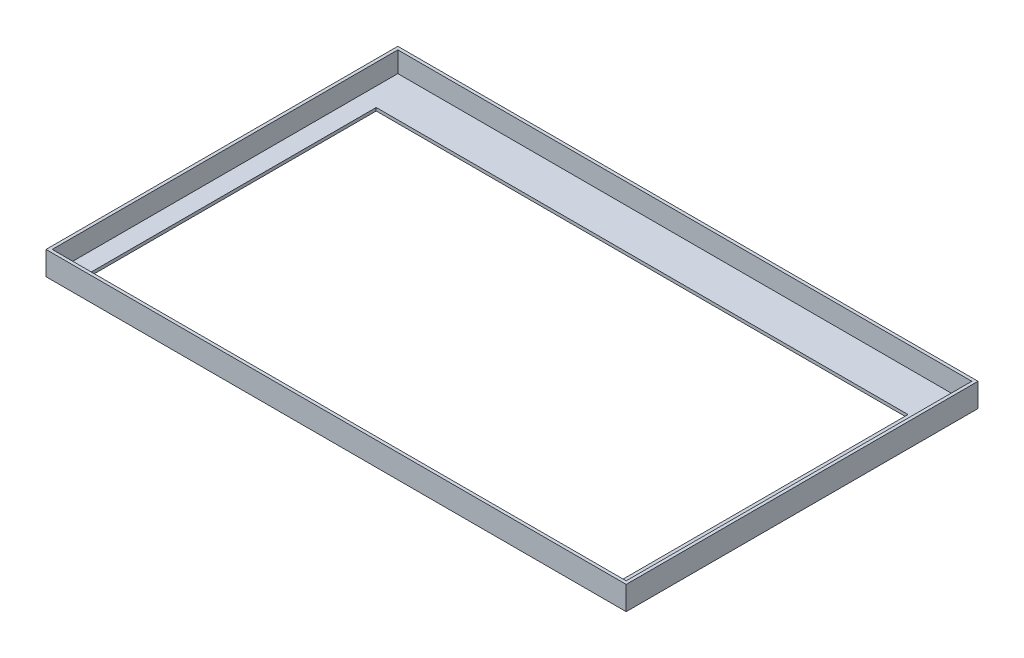
ISO-10303-21;
HEADER;
FILE_DESCRIPTION(('STEP AP214'),'2;1');
FILE_NAME('part.step','',(''),(''),'','','');
FILE_SCHEMA(('AUTOMOTIVE_DESIGN { 1 0 10303 214 1 1 1 1 }'));
ENDSEC;
DATA;
#1=APPLICATION_CONTEXT('core data for automotive mechanical design processes');
#2=APPLICATION_PROTOCOL_DEFINITION('international standard','automotive_design',2000,#1);
#3=PRODUCT_CONTEXT('',#1,'mechanical');
#4=PRODUCT('Part','Part','',(#3));
#5=PRODUCT_RELATED_PRODUCT_CATEGORY('part','',(#4));
#6=PRODUCT_DEFINITION_FORMATION('','',#4);
#7=PRODUCT_DEFINITION_CONTEXT('part definition',#1,'design');
#8=PRODUCT_DEFINITION('design','',#6,#7);
#9=PRODUCT_DEFINITION_SHAPE('','',#8);
#10=(LENGTH_UNIT() NAMED_UNIT(*) SI_UNIT(.MILLI.,.METRE.));
#11=(NAMED_UNIT(*) PLANE_ANGLE_UNIT() SI_UNIT($,.RADIAN.));
#12=(NAMED_UNIT(*) SI_UNIT($,.STERADIAN.) SOLID_ANGLE_UNIT());
#13=UNCERTAINTY_MEASURE_WITH_UNIT(LENGTH_MEASURE(1.E-05),#10,'distance_accuracy_value','');
#14=(GEOMETRIC_REPRESENTATION_CONTEXT(3) GLOBAL_UNCERTAINTY_ASSIGNED_CONTEXT((#13)) GLOBAL_UNIT_ASSIGNED_CONTEXT((#10,
#11,#12)) REPRESENTATION_CONTEXT('',''));
#15=CARTESIAN_POINT('',(0.,0.,0.));
#16=DIRECTION('',(0.,0.,1.));
#17=DIRECTION('',(1.,0.,0.));
#18=AXIS2_PLACEMENT_3D('',#15,#16,#17);
#19=CARTESIAN_POINT('',(0.,1.5,0.));
#20=DIRECTION('',(1.,0.,0.));
#21=DIRECTION('',(0.,0.,-1.));
#22=AXIS2_PLACEMENT_3D('',#19,#20,#21);
#23=PLANE('',#22);
#24=DIRECTION('',(0.,0.,1.));
#25=VECTOR('',#24,1.);
#26=CARTESIAN_POINT('',(0.,0.,0.));
#27=LINE('',#26,#25);
#28=CARTESIAN_POINT('',(0.,0.,0.));
#29=VERTEX_POINT('',#28);
#30=CARTESIAN_POINT('',(0.,0.,171.));
#31=VERTEX_POINT('',#30);
#32=EDGE_CURVE('E199',#29,#31,#27,.T.);
#33=ORIENTED_EDGE('',*,*,#32,.T.);
#34=DIRECTION('',(0.,-1.,0.));
#35=VECTOR('',#34,1.);
#36=CARTESIAN_POINT('',(0.,1.5,171.));
#37=LINE('',#36,#35);
#38=CARTESIAN_POINT('',(0.,11.5,171.));
#39=VERTEX_POINT('',#38);
#40=EDGE_CURVE('E11',#39,#31,#37,.T.);
#41=ORIENTED_EDGE('',*,*,#40,.F.);
#42=DIRECTION('',(0.,0.,1.));
#43=VECTOR('',#42,1.);
#44=CARTESIAN_POINT('',(0.,11.5,171.));
#45=LINE('',#44,#43);
#46=CARTESIAN_POINT('',(0.,11.5,0.));
#47=VERTEX_POINT('',#46);
#48=EDGE_CURVE('E187',#47,#39,#45,.T.);
#49=ORIENTED_EDGE('',*,*,#48,.F.);
#50=DIRECTION('',(0.,-1.,0.));
#51=VECTOR('',#50,1.);
#52=CARTESIAN_POINT('',(0.,1.5,0.));
#53=LINE('',#52,#51);
#54=EDGE_CURVE('E208',#47,#29,#53,.T.);
#55=ORIENTED_EDGE('',*,*,#54,.T.);
#56=EDGE_LOOP('',(#33,#41,#49,#55));
#57=FACE_BOUND('',#56,.T.);
#58=ADVANCED_FACE('F33',(#57),#23,.F.);
#59=CARTESIAN_POINT('',(0.,1.5,171.));
#60=DIRECTION('',(0.,0.,-1.));
#61=DIRECTION('',(-1.,0.,0.));
#62=AXIS2_PLACEMENT_3D('',#59,#60,#61);
#63=PLANE('',#62);
#64=DIRECTION('',(1.,0.,0.));
#65=VECTOR('',#64,1.);
#66=CARTESIAN_POINT('',(0.,0.,171.));
#67=LINE('',#66,#65);
#68=CARTESIAN_POINT('',(282.,0.,171.));
#69=VERTEX_POINT('',#68);
#70=EDGE_CURVE('E202',#31,#69,#67,.T.);
#71=ORIENTED_EDGE('',*,*,#70,.T.);
#72=DIRECTION('',(0.,-1.,0.));
#73=VECTOR('',#72,1.);
#74=CARTESIAN_POINT('',(282.,1.5,171.));
#75=LINE('',#74,#73);
#76=CARTESIAN_POINT('',(282.,11.5,171.));
#77=VERTEX_POINT('',#76);
#78=EDGE_CURVE('E40',#77,#69,#75,.T.);
#79=ORIENTED_EDGE('',*,*,#78,.F.);
#80=DIRECTION('',(1.,0.,0.));
#81=VECTOR('',#80,1.);
#82=CARTESIAN_POINT('',(0.,11.5,171.));
#83=LINE('',#82,#81);
#84=EDGE_CURVE('E190',#39,#77,#83,.T.);
#85=ORIENTED_EDGE('',*,*,#84,.F.);
#86=ORIENTED_EDGE('',*,*,#40,.T.);
#87=EDGE_LOOP('',(#71,#79,#85,#86));
#88=FACE_BOUND('',#87,.T.);
#89=ADVANCED_FACE('F232',(#88),#63,.F.);
#90=CARTESIAN_POINT('',(282.,1.5,0.));
#91=DIRECTION('',(-1.,0.,0.));
#92=DIRECTION('',(0.,0.,1.));
#93=AXIS2_PLACEMENT_3D('',#90,#91,#92);
#94=PLANE('',#93);
#95=DIRECTION('',(0.,0.,-1.));
#96=VECTOR('',#95,1.);
#97=CARTESIAN_POINT('',(282.,0.,0.));
#98=LINE('',#97,#96);
#99=CARTESIAN_POINT('',(282.,0.,0.));
#100=VERTEX_POINT('',#99);
#101=EDGE_CURVE('E204',#69,#100,#98,.T.);
#102=ORIENTED_EDGE('',*,*,#101,.T.);
#103=DIRECTION('',(0.,-1.,0.));
#104=VECTOR('',#103,1.);
#105=CARTESIAN_POINT('',(282.,1.5,0.));
#106=LINE('',#105,#104);
#107=CARTESIAN_POINT('',(282.,11.5,0.));
#108=VERTEX_POINT('',#107);
#109=EDGE_CURVE('E211',#108,#100,#106,.T.);
#110=ORIENTED_EDGE('',*,*,#109,.F.);
#111=DIRECTION('',(0.,0.,-1.));
#112=VECTOR('',#111,1.);
#113=CARTESIAN_POINT('',(282.,11.5,171.));
#114=LINE('',#113,#112);
#115=EDGE_CURVE('E193',#77,#108,#114,.T.);
#116=ORIENTED_EDGE('',*,*,#115,.F.);
#117=ORIENTED_EDGE('',*,*,#78,.T.);
#118=EDGE_LOOP('',(#102,#110,#116,#117));
#119=FACE_BOUND('',#118,.T.);
#120=ADVANCED_FACE('F217',(#119),#94,.F.);
#121=CARTESIAN_POINT('',(0.,1.5,0.));
#122=DIRECTION('',(0.,0.,1.));
#123=DIRECTION('',(1.,0.,0.));
#124=AXIS2_PLACEMENT_3D('',#121,#122,#123);
#125=PLANE('',#124);
#126=DIRECTION('',(-1.,0.,0.));
#127=VECTOR('',#126,1.);
#128=CARTESIAN_POINT('',(0.,0.,0.));
#129=LINE('',#128,#127);
#130=EDGE_CURVE('E206',#100,#29,#129,.T.);
#131=ORIENTED_EDGE('',*,*,#130,.T.);
#132=ORIENTED_EDGE('',*,*,#54,.F.);
#133=DIRECTION('',(-1.,0.,0.));
#134=VECTOR('',#133,1.);
#135=CARTESIAN_POINT('',(0.,11.5,0.));
#136=LINE('',#135,#134);
#137=EDGE_CURVE('E196',#108,#47,#136,.T.);
#138=ORIENTED_EDGE('',*,*,#137,.F.);
#139=ORIENTED_EDGE('',*,*,#109,.T.);
#140=EDGE_LOOP('',(#131,#132,#138,#139));
#141=FACE_BOUND('',#140,.T.);
#142=ADVANCED_FACE('F225',(#141),#125,.F.);
#143=CARTESIAN_POINT('',(0.,0.,0.));
#144=DIRECTION('',(0.,1.,0.));
#145=DIRECTION('',(0.,0.,1.));
#146=AXIS2_PLACEMENT_3D('',#143,#144,#145);
#147=PLANE('',#146);
#148=DIRECTION('',(-1.,0.,0.));
#149=VECTOR('',#148,1.);
#150=CARTESIAN_POINT('',(0.,0.,21.));
#151=LINE('',#150,#149);
#152=CARTESIAN_POINT('',(269.,0.,21.));
#153=VERTEX_POINT('',#152);
#154=CARTESIAN_POINT('',(10.5,0.,21.));
#155=VERTEX_POINT('',#154);
#156=EDGE_CURVE('E152',#153,#155,#151,.T.);
#157=ORIENTED_EDGE('',*,*,#156,.T.);
#158=DIRECTION('',(0.,0.,1.));
#159=VECTOR('',#158,1.);
#160=CARTESIAN_POINT('',(10.5,0.,0.));
#161=LINE('',#160,#159);
#162=CARTESIAN_POINT('',(10.5,0.,166.));
#163=VERTEX_POINT('',#162);
#164=EDGE_CURVE('E155',#155,#163,#161,.T.);
#165=ORIENTED_EDGE('',*,*,#164,.T.);
#166=DIRECTION('',(1.,0.,0.));
#167=VECTOR('',#166,1.);
#168=CARTESIAN_POINT('',(0.,0.,166.));
#169=LINE('',#168,#167);
#170=CARTESIAN_POINT('',(269.,0.,166.));
#171=VERTEX_POINT('',#170);
#172=EDGE_CURVE('E147',#163,#171,#169,.T.);
#173=ORIENTED_EDGE('',*,*,#172,.T.);
#174=DIRECTION('',(0.,0.,-1.));
#175=VECTOR('',#174,1.);
#176=CARTESIAN_POINT('',(269.,0.,0.));
#177=LINE('',#176,#175);
#178=EDGE_CURVE('E127',#171,#153,#177,.T.);
#179=ORIENTED_EDGE('',*,*,#178,.T.);
#180=EDGE_LOOP('',(#157,#165,#173,#179));
#181=FACE_BOUND('',#180,.T.);
#182=ORIENTED_EDGE('',*,*,#32,.F.);
#183=ORIENTED_EDGE('',*,*,#130,.F.);
#184=ORIENTED_EDGE('',*,*,#101,.F.);
#185=ORIENTED_EDGE('',*,*,#70,.F.);
#186=EDGE_LOOP('',(#182,#183,#184,#185));
#187=FACE_BOUND('',#186,.T.);
#188=ADVANCED_FACE('F223',(#181,#187),#147,.F.);
#189=CARTESIAN_POINT('',(0.,11.5,0.));
#190=DIRECTION('',(0.,-1.,0.));
#191=DIRECTION('',(0.,0.,-1.));
#192=AXIS2_PLACEMENT_3D('',#189,#190,#191);
#193=PLANE('',#192);
#194=ORIENTED_EDGE('',*,*,#48,.T.);
#195=ORIENTED_EDGE('',*,*,#84,.T.);
#196=ORIENTED_EDGE('',*,*,#115,.T.);
#197=ORIENTED_EDGE('',*,*,#137,.T.);
#198=EDGE_LOOP('',(#194,#195,#196,#197));
#199=FACE_BOUND('',#198,.T.);
#200=DIRECTION('',(1.,0.,0.));
#201=VECTOR('',#200,1.);
#202=CARTESIAN_POINT('',(1.5,11.5,169.5));
#203=LINE('',#202,#201);
#204=CARTESIAN_POINT('',(1.5,11.5,169.5));
#205=VERTEX_POINT('',#204);
#206=CARTESIAN_POINT('',(280.5,11.5,169.5));
#207=VERTEX_POINT('',#206);
#208=EDGE_CURVE('E159',#205,#207,#203,.T.);
#209=ORIENTED_EDGE('',*,*,#208,.F.);
#210=DIRECTION('',(0.,0.,1.));
#211=VECTOR('',#210,1.);
#212=CARTESIAN_POINT('',(1.5,11.5,169.5));
#213=LINE('',#212,#211);
#214=CARTESIAN_POINT('',(1.5,11.5,1.5));
#215=VERTEX_POINT('',#214);
#216=EDGE_CURVE('E167',#215,#205,#213,.T.);
#217=ORIENTED_EDGE('',*,*,#216,.F.);
#218=DIRECTION('',(-1.,0.,0.));
#219=VECTOR('',#218,1.);
#220=CARTESIAN_POINT('',(1.5,11.5,1.5));
#221=LINE('',#220,#219);
#222=CARTESIAN_POINT('',(280.5,11.5,1.5));
#223=VERTEX_POINT('',#222);
#224=EDGE_CURVE('E164',#223,#215,#221,.T.);
#225=ORIENTED_EDGE('',*,*,#224,.F.);
#226=DIRECTION('',(0.,0.,-1.));
#227=VECTOR('',#226,1.);
#228=CARTESIAN_POINT('',(280.5,11.5,169.5));
#229=LINE('',#228,#227);
#230=EDGE_CURVE('E161',#207,#223,#229,.T.);
#231=ORIENTED_EDGE('',*,*,#230,.F.);
#232=EDGE_LOOP('',(#209,#217,#225,#231));
#233=FACE_BOUND('',#232,.T.);
#234=ADVANCED_FACE('F230',(#199,#233),#193,.F.);
#235=CARTESIAN_POINT('',(1.5,11.5,169.5));
#236=DIRECTION('',(0.,0.,-1.));
#237=DIRECTION('',(-1.,0.,0.));
#238=AXIS2_PLACEMENT_3D('',#235,#236,#237);
#239=PLANE('',#238);
#240=DIRECTION('',(1.,0.,0.));
#241=VECTOR('',#240,1.);
#242=CARTESIAN_POINT('',(1.5,1.5,169.5));
#243=LINE('',#242,#241);
#244=CARTESIAN_POINT('',(1.5,1.5,169.5));
#245=VERTEX_POINT('',#244);
#246=CARTESIAN_POINT('',(280.5,1.5,169.5));
#247=VERTEX_POINT('',#246);
#248=EDGE_CURVE('E158',#245,#247,#243,.T.);
#249=ORIENTED_EDGE('',*,*,#248,.F.);
#250=DIRECTION('',(0.,-1.,0.));
#251=VECTOR('',#250,1.);
#252=CARTESIAN_POINT('',(1.5,11.5,169.5));
#253=LINE('',#252,#251);
#254=EDGE_CURVE('E169',#205,#245,#253,.T.);
#255=ORIENTED_EDGE('',*,*,#254,.F.);
#256=ORIENTED_EDGE('',*,*,#208,.T.);
#257=DIRECTION('',(0.,-1.,0.));
#258=VECTOR('',#257,1.);
#259=CARTESIAN_POINT('',(280.5,11.5,169.5));
#260=LINE('',#259,#258);
#261=EDGE_CURVE('E184',#207,#247,#260,.T.);
#262=ORIENTED_EDGE('',*,*,#261,.T.);
#263=EDGE_LOOP('',(#249,#255,#256,#262));
#264=FACE_BOUND('',#263,.T.);
#265=ADVANCED_FACE('F251',(#264),#239,.T.);
#266=CARTESIAN_POINT('',(280.5,11.5,169.5));
#267=DIRECTION('',(-1.,0.,0.));
#268=DIRECTION('',(0.,0.,1.));
#269=AXIS2_PLACEMENT_3D('',#266,#267,#268);
#270=PLANE('',#269);
#271=DIRECTION('',(0.,0.,-1.));
#272=VECTOR('',#271,1.);
#273=CARTESIAN_POINT('',(280.5,1.5,169.5));
#274=LINE('',#273,#272);
#275=CARTESIAN_POINT('',(280.5,1.5,1.5));
#276=VERTEX_POINT('',#275);
#277=EDGE_CURVE('E171',#247,#276,#274,.T.);
#278=ORIENTED_EDGE('',*,*,#277,.F.);
#279=ORIENTED_EDGE('',*,*,#261,.F.);
#280=ORIENTED_EDGE('',*,*,#230,.T.);
#281=DIRECTION('',(0.,-1.,0.));
#282=VECTOR('',#281,1.);
#283=CARTESIAN_POINT('',(280.5,11.5,1.5));
#284=LINE('',#283,#282);
#285=EDGE_CURVE('E181',#223,#276,#284,.T.);
#286=ORIENTED_EDGE('',*,*,#285,.T.);
#287=EDGE_LOOP('',(#278,#279,#280,#286));
#288=FACE_BOUND('',#287,.T.);
#289=ADVANCED_FACE('F254',(#288),#270,.T.);
#290=CARTESIAN_POINT('',(1.5,11.5,1.5));
#291=DIRECTION('',(0.,0.,1.));
#292=DIRECTION('',(1.,0.,0.));
#293=AXIS2_PLACEMENT_3D('',#290,#291,#292);
#294=PLANE('',#293);
#295=DIRECTION('',(-1.,0.,0.));
#296=VECTOR('',#295,1.);
#297=CARTESIAN_POINT('',(1.5,1.5,1.5));
#298=LINE('',#297,#296);
#299=CARTESIAN_POINT('',(1.5,1.5,1.5));
#300=VERTEX_POINT('',#299);
#301=EDGE_CURVE('E173',#276,#300,#298,.T.);
#302=ORIENTED_EDGE('',*,*,#301,.F.);
#303=ORIENTED_EDGE('',*,*,#285,.F.);
#304=ORIENTED_EDGE('',*,*,#224,.T.);
#305=DIRECTION('',(0.,-1.,0.));
#306=VECTOR('',#305,1.);
#307=CARTESIAN_POINT('',(1.5,11.5,1.5));
#308=LINE('',#307,#306);
#309=EDGE_CURVE('E178',#215,#300,#308,.T.);
#310=ORIENTED_EDGE('',*,*,#309,.T.);
#311=EDGE_LOOP('',(#302,#303,#304,#310));
#312=FACE_BOUND('',#311,.T.);
#313=ADVANCED_FACE('F258',(#312),#294,.T.);
#314=CARTESIAN_POINT('',(1.5,11.5,169.5));
#315=DIRECTION('',(1.,0.,0.));
#316=DIRECTION('',(0.,0.,-1.));
#317=AXIS2_PLACEMENT_3D('',#314,#315,#316);
#318=PLANE('',#317);
#319=DIRECTION('',(0.,0.,1.));
#320=VECTOR('',#319,1.);
#321=CARTESIAN_POINT('',(1.5,1.5,169.5));
#322=LINE('',#321,#320);
#323=EDGE_CURVE('E162',#300,#245,#322,.T.);
#324=ORIENTED_EDGE('',*,*,#323,.F.);
#325=ORIENTED_EDGE('',*,*,#309,.F.);
#326=ORIENTED_EDGE('',*,*,#216,.T.);
#327=ORIENTED_EDGE('',*,*,#254,.T.);
#328=EDGE_LOOP('',(#324,#325,#326,#327));
#329=FACE_BOUND('',#328,.T.);
#330=ADVANCED_FACE('F248',(#329),#318,.T.);
#331=CARTESIAN_POINT('',(0.,1.5,0.));
#332=DIRECTION('',(0.,1.,0.));
#333=DIRECTION('',(0.,0.,1.));
#334=AXIS2_PLACEMENT_3D('',#331,#332,#333);
#335=PLANE('',#334);
#336=DIRECTION('',(0.,0.,1.));
#337=VECTOR('',#336,1.);
#338=CARTESIAN_POINT('',(10.5,1.5,166.));
#339=LINE('',#338,#337);
#340=CARTESIAN_POINT('',(10.5,1.5,21.));
#341=VERTEX_POINT('',#340);
#342=CARTESIAN_POINT('',(10.5,1.5,166.));
#343=VERTEX_POINT('',#342);
#344=EDGE_CURVE('E55',#341,#343,#339,.T.);
#345=ORIENTED_EDGE('',*,*,#344,.F.);
#346=DIRECTION('',(-1.,0.,0.));
#347=VECTOR('',#346,1.);
#348=CARTESIAN_POINT('',(10.5,1.5,21.));
#349=LINE('',#348,#347);
#350=CARTESIAN_POINT('',(269.,1.5,21.));
#351=VERTEX_POINT('',#350);
#352=EDGE_CURVE('E140',#351,#341,#349,.T.);
#353=ORIENTED_EDGE('',*,*,#352,.F.);
#354=DIRECTION('',(0.,0.,-1.));
#355=VECTOR('',#354,1.);
#356=CARTESIAN_POINT('',(269.,1.5,166.));
#357=LINE('',#356,#355);
#358=CARTESIAN_POINT('',(269.,1.5,166.));
#359=VERTEX_POINT('',#358);
#360=EDGE_CURVE('E124',#359,#351,#357,.T.);
#361=ORIENTED_EDGE('',*,*,#360,.F.);
#362=DIRECTION('',(1.,0.,0.));
#363=VECTOR('',#362,1.);
#364=CARTESIAN_POINT('',(10.5,1.5,166.));
#365=LINE('',#364,#363);
#366=EDGE_CURVE('E133',#343,#359,#365,.T.);
#367=ORIENTED_EDGE('',*,*,#366,.F.);
#368=EDGE_LOOP('',(#345,#353,#361,#367));
#369=FACE_BOUND('',#368,.T.);
#370=ORIENTED_EDGE('',*,*,#248,.T.);
#371=ORIENTED_EDGE('',*,*,#277,.T.);
#372=ORIENTED_EDGE('',*,*,#301,.T.);
#373=ORIENTED_EDGE('',*,*,#323,.T.);
#374=EDGE_LOOP('',(#370,#371,#372,#373));
#375=FACE_BOUND('',#374,.T.);
#376=ADVANCED_FACE('F137',(#369,#375),#335,.T.);
#377=CARTESIAN_POINT('',(10.5,-8.5,166.));
#378=DIRECTION('',(-1.,0.,0.));
#379=DIRECTION('',(0.,0.,1.));
#380=AXIS2_PLACEMENT_3D('',#377,#378,#379);
#381=PLANE('',#380);
#382=DIRECTION('',(0.,1.,0.));
#383=VECTOR('',#382,1.);
#384=CARTESIAN_POINT('',(10.5,-8.5,21.));
#385=LINE('',#384,#383);
#386=EDGE_CURVE('E145',#155,#341,#385,.T.);
#387=ORIENTED_EDGE('',*,*,#386,.T.);
#388=ORIENTED_EDGE('',*,*,#344,.T.);
#389=DIRECTION('',(0.,1.,0.));
#390=VECTOR('',#389,1.);
#391=CARTESIAN_POINT('',(10.5,-8.5,166.));
#392=LINE('',#391,#390);
#393=EDGE_CURVE('E130',#163,#343,#392,.T.);
#394=ORIENTED_EDGE('',*,*,#393,.F.);
#395=ORIENTED_EDGE('',*,*,#164,.F.);
#396=EDGE_LOOP('',(#387,#388,#394,#395));
#397=FACE_BOUND('',#396,.T.);
#398=ADVANCED_FACE('F247',(#397),#381,.F.);
#399=CARTESIAN_POINT('',(10.5,-8.5,21.));
#400=DIRECTION('',(0.,0.,-1.));
#401=DIRECTION('',(-1.,0.,0.));
#402=AXIS2_PLACEMENT_3D('',#399,#400,#401);
#403=PLANE('',#402);
#404=DIRECTION('',(0.,1.,0.));
#405=VECTOR('',#404,1.);
#406=CARTESIAN_POINT('',(269.,-8.5,21.));
#407=LINE('',#406,#405);
#408=EDGE_CURVE('E129',#153,#351,#407,.T.);
#409=ORIENTED_EDGE('',*,*,#408,.T.);
#410=ORIENTED_EDGE('',*,*,#352,.T.);
#411=ORIENTED_EDGE('',*,*,#386,.F.);
#412=ORIENTED_EDGE('',*,*,#156,.F.);
#413=EDGE_LOOP('',(#409,#410,#411,#412));
#414=FACE_BOUND('',#413,.T.);
#415=ADVANCED_FACE('F268',(#414),#403,.F.);
#416=CARTESIAN_POINT('',(269.,-8.5,166.));
#417=DIRECTION('',(1.,0.,0.));
#418=DIRECTION('',(0.,0.,-1.));
#419=AXIS2_PLACEMENT_3D('',#416,#417,#418);
#420=PLANE('',#419);
#421=DIRECTION('',(0.,1.,0.));
#422=VECTOR('',#421,1.);
#423=CARTESIAN_POINT('',(269.,-8.5,166.));
#424=LINE('',#423,#422);
#425=EDGE_CURVE('E47',#171,#359,#424,.T.);
#426=ORIENTED_EDGE('',*,*,#425,.T.);
#427=ORIENTED_EDGE('',*,*,#360,.T.);
#428=ORIENTED_EDGE('',*,*,#408,.F.);
#429=ORIENTED_EDGE('',*,*,#178,.F.);
#430=EDGE_LOOP('',(#426,#427,#428,#429));
#431=FACE_BOUND('',#430,.T.);
#432=ADVANCED_FACE('F121',(#431),#420,.F.);
#433=CARTESIAN_POINT('',(10.5,-8.5,166.));
#434=DIRECTION('',(0.,0.,1.));
#435=DIRECTION('',(1.,0.,0.));
#436=AXIS2_PLACEMENT_3D('',#433,#434,#435);
#437=PLANE('',#436);
#438=ORIENTED_EDGE('',*,*,#393,.T.);
#439=ORIENTED_EDGE('',*,*,#366,.T.);
#440=ORIENTED_EDGE('',*,*,#425,.F.);
#441=ORIENTED_EDGE('',*,*,#172,.F.);
#442=EDGE_LOOP('',(#438,#439,#440,#441));
#443=FACE_BOUND('',#442,.T.);
#444=ADVANCED_FACE('F134',(#443),#437,.F.);
#445=CLOSED_SHELL('',(#58,#89,#120,#142,#188,#234,#265,#289,#313,#330,#376,#398,#415,#432,#444));
#446=MANIFOLD_SOLID_BREP('B2',#445);
#447=ADVANCED_BREP_SHAPE_REPRESENTATION('',(#18,#446),#14);
#448=SHAPE_DEFINITION_REPRESENTATION(#9,#447);
ENDSEC;
END-ISO-10303-21;
